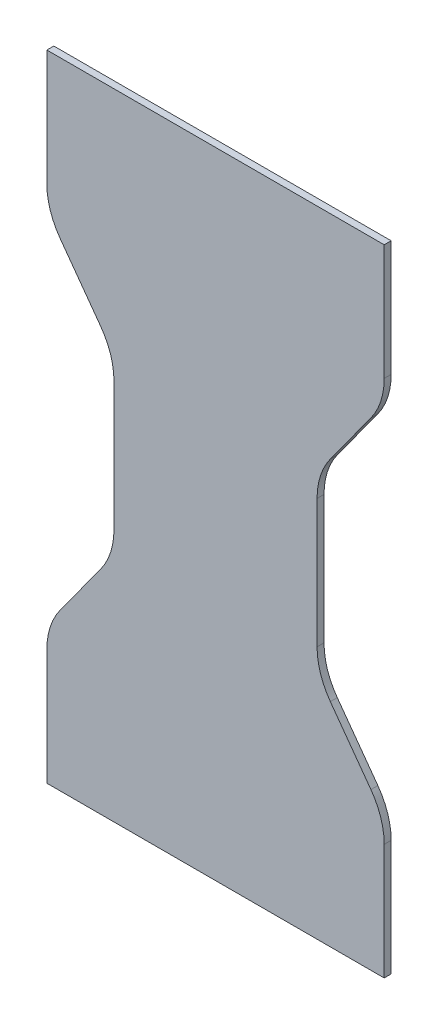
ISO-10303-21;
HEADER;
FILE_DESCRIPTION(('STEP AP214'),'2;1');
FILE_NAME('part.step','',(''),(''),'','','');
FILE_SCHEMA(('AUTOMOTIVE_DESIGN { 1 0 10303 214 1 1 1 1 }'));
ENDSEC;
DATA;
#1=APPLICATION_CONTEXT('core data for automotive mechanical design processes');
#2=APPLICATION_PROTOCOL_DEFINITION('international standard','automotive_design',2000,#1);
#3=PRODUCT_CONTEXT('',#1,'mechanical');
#4=PRODUCT('Part','Part','',(#3));
#5=PRODUCT_RELATED_PRODUCT_CATEGORY('part','',(#4));
#6=PRODUCT_DEFINITION_FORMATION('','',#4);
#7=PRODUCT_DEFINITION_CONTEXT('part definition',#1,'design');
#8=PRODUCT_DEFINITION('design','',#6,#7);
#9=PRODUCT_DEFINITION_SHAPE('','',#8);
#10=(LENGTH_UNIT() NAMED_UNIT(*) SI_UNIT(.MILLI.,.METRE.));
#11=(NAMED_UNIT(*) PLANE_ANGLE_UNIT() SI_UNIT($,.RADIAN.));
#12=(NAMED_UNIT(*) SI_UNIT($,.STERADIAN.) SOLID_ANGLE_UNIT());
#13=UNCERTAINTY_MEASURE_WITH_UNIT(LENGTH_MEASURE(1.E-05),#10,'distance_accuracy_value','');
#14=(GEOMETRIC_REPRESENTATION_CONTEXT(3) GLOBAL_UNCERTAINTY_ASSIGNED_CONTEXT((#13)) GLOBAL_UNIT_ASSIGNED_CONTEXT((#10,
#11,#12)) REPRESENTATION_CONTEXT('',''));
#15=CARTESIAN_POINT('',(0.,0.,0.));
#16=DIRECTION('',(0.,0.,1.));
#17=DIRECTION('',(1.,0.,0.));
#18=AXIS2_PLACEMENT_3D('',#15,#16,#17);
#19=CARTESIAN_POINT('',(-72.8627802887353,77.4150756936639,3.));
#20=DIRECTION('',(1.,0.,0.));
#21=DIRECTION('',(0.,1.,0.));
#22=AXIS2_PLACEMENT_3D('',#19,#20,#21);
#23=PLANE('',#22);
#24=DIRECTION('',(0.,-1.,0.));
#25=VECTOR('',#24,1.);
#26=CARTESIAN_POINT('',(-72.8627802887353,77.4150756936639,0.));
#27=LINE('',#26,#25);
#28=CARTESIAN_POINT('',(-72.8627802887354,137.153468778796,0.));
#29=VERTEX_POINT('',#28);
#30=CARTESIAN_POINT('',(-72.8627802887353,87.162666580651,0.));
#31=VERTEX_POINT('',#30);
#32=EDGE_CURVE('E213',#29,#31,#27,.T.);
#33=ORIENTED_EDGE('',*,*,#32,.T.);
#34=DIRECTION('',(0.,0.,-1.));
#35=VECTOR('',#34,1.);
#36=CARTESIAN_POINT('',(-72.8627802887353,87.162666580651,3.));
#37=LINE('',#36,#35);
#38=CARTESIAN_POINT('',(-72.8627802887353,87.162666580651,3.));
#39=VERTEX_POINT('',#38);
#40=EDGE_CURVE('E300',#31,#39,#37,.F.);
#41=ORIENTED_EDGE('',*,*,#40,.T.);
#42=DIRECTION('',(0.,-1.,0.));
#43=VECTOR('',#42,1.);
#44=CARTESIAN_POINT('',(-72.8627802887353,77.4150756936639,3.));
#45=LINE('',#44,#43);
#46=CARTESIAN_POINT('',(-72.8627802887354,137.153468778796,3.));
#47=VERTEX_POINT('',#46);
#48=EDGE_CURVE('E243',#47,#39,#45,.T.);
#49=ORIENTED_EDGE('',*,*,#48,.F.);
#50=DIRECTION('',(0.,0.,-1.));
#51=VECTOR('',#50,1.);
#52=CARTESIAN_POINT('',(-72.8627802887354,137.153468778796,3.));
#53=LINE('',#52,#51);
#54=EDGE_CURVE('E212',#47,#29,#53,.T.);
#55=ORIENTED_EDGE('',*,*,#54,.T.);
#56=EDGE_LOOP('',(#33,#41,#49,#55));
#57=FACE_BOUND('',#56,.T.);
#58=ADVANCED_FACE('F32',(#57),#23,.F.);
#59=CARTESIAN_POINT('',(-43.8627802887353,37.5,3.));
#60=DIRECTION('',(0.809016994374946,0.587785252292475,0.));
#61=DIRECTION('',(-0.587785252292475,0.809016994374946,0.));
#62=AXIS2_PLACEMENT_3D('',#59,#60,#61);
#63=PLANE('',#62);
#64=DIRECTION('',(0.587785252292475,-0.809016994374946,0.));
#65=VECTOR('',#64,1.);
#66=CARTESIAN_POINT('',(-43.8627802887353,37.5,0.));
#67=LINE('',#66,#65);
#68=CARTESIAN_POINT('',(-67.1332901199837,69.5291090118769,0.));
#69=VERTEX_POINT('',#68);
#70=CARTESIAN_POINT('',(-49.5922704574869,45.385966681787,0.));
#71=VERTEX_POINT('',#70);
#72=EDGE_CURVE('E216',#69,#71,#67,.T.);
#73=ORIENTED_EDGE('',*,*,#72,.T.);
#74=DIRECTION('',(0.,0.,-1.));
#75=VECTOR('',#74,1.);
#76=CARTESIAN_POINT('',(-49.5922704574869,45.385966681787,3.));
#77=LINE('',#76,#75);
#78=CARTESIAN_POINT('',(-49.5922704574869,45.385966681787,3.));
#79=VERTEX_POINT('',#78);
#80=EDGE_CURVE('E298',#71,#79,#77,.F.);
#81=ORIENTED_EDGE('',*,*,#80,.T.);
#82=DIRECTION('',(0.587785252292475,-0.809016994374946,0.));
#83=VECTOR('',#82,1.);
#84=CARTESIAN_POINT('',(-43.8627802887353,37.5,3.));
#85=LINE('',#84,#83);
#86=CARTESIAN_POINT('',(-67.1332901199837,69.5291090118769,3.));
#87=VERTEX_POINT('',#86);
#88=EDGE_CURVE('E331',#87,#79,#85,.T.);
#89=ORIENTED_EDGE('',*,*,#88,.F.);
#90=DIRECTION('',(0.,0.,-1.));
#91=VECTOR('',#90,1.);
#92=CARTESIAN_POINT('',(-67.1332901199836,69.5291090118769,3.));
#93=LINE('',#92,#91);
#94=EDGE_CURVE('E295',#87,#69,#93,.T.);
#95=ORIENTED_EDGE('',*,*,#94,.T.);
#96=EDGE_LOOP('',(#73,#81,#89,#95));
#97=FACE_BOUND('',#96,.T.);
#98=ADVANCED_FACE('F321',(#97),#63,.F.);
#99=CARTESIAN_POINT('',(-43.8627802887353,-37.5,3.));
#100=DIRECTION('',(1.,0.,0.));
#101=DIRECTION('',(0.,0.,-1.));
#102=AXIS2_PLACEMENT_3D('',#99,#100,#101);
#103=PLANE('',#102);
#104=DIRECTION('',(0.,-1.,0.));
#105=VECTOR('',#104,1.);
#106=CARTESIAN_POINT('',(-43.8627802887353,-37.5,0.));
#107=LINE('',#106,#105);
#108=CARTESIAN_POINT('',(-43.8627802887353,27.7524091130128,0.));
#109=VERTEX_POINT('',#108);
#110=CARTESIAN_POINT('',(-43.8627802887353,-27.7524091130129,0.));
#111=VERTEX_POINT('',#110);
#112=EDGE_CURVE('E219',#109,#111,#107,.T.);
#113=ORIENTED_EDGE('',*,*,#112,.T.);
#114=DIRECTION('',(0.,0.,-1.));
#115=VECTOR('',#114,1.);
#116=CARTESIAN_POINT('',(-43.8627802887353,-27.7524091130129,3.));
#117=LINE('',#116,#115);
#118=CARTESIAN_POINT('',(-43.8627802887353,-27.7524091130129,3.));
#119=VERTEX_POINT('',#118);
#120=EDGE_CURVE('E291',#111,#119,#117,.F.);
#121=ORIENTED_EDGE('',*,*,#120,.T.);
#122=DIRECTION('',(0.,-1.,0.));
#123=VECTOR('',#122,1.);
#124=CARTESIAN_POINT('',(-43.8627802887353,-37.5,3.));
#125=LINE('',#124,#123);
#126=CARTESIAN_POINT('',(-43.8627802887353,27.7524091130128,3.));
#127=VERTEX_POINT('',#126);
#128=EDGE_CURVE('E329',#127,#119,#125,.T.);
#129=ORIENTED_EDGE('',*,*,#128,.F.);
#130=DIRECTION('',(0.,0.,-1.));
#131=VECTOR('',#130,1.);
#132=CARTESIAN_POINT('',(-43.8627802887353,27.7524091130128,0.));
#133=LINE('',#132,#131);
#134=EDGE_CURVE('E288',#127,#109,#133,.T.);
#135=ORIENTED_EDGE('',*,*,#134,.T.);
#136=EDGE_LOOP('',(#113,#121,#129,#135));
#137=FACE_BOUND('',#136,.T.);
#138=ADVANCED_FACE('F333',(#137),#103,.F.);
#139=CARTESIAN_POINT('',(-43.8627802887353,-37.5,3.));
#140=DIRECTION('',(0.809016994374951,-0.587785252292468,0.));
#141=DIRECTION('',(0.587785252292468,0.809016994374951,0.));
#142=AXIS2_PLACEMENT_3D('',#139,#140,#141);
#143=PLANE('',#142);
#144=DIRECTION('',(-0.587785252292468,-0.809016994374951,0.));
#145=VECTOR('',#144,1.);
#146=CARTESIAN_POINT('',(-43.8627802887353,-37.5,3.));
#147=LINE('',#146,#145);
#148=CARTESIAN_POINT('',(-49.5922704574867,-45.385966681787,3.));
#149=VERTEX_POINT('',#148);
#150=CARTESIAN_POINT('',(-67.1332901199838,-69.5291090118776,3.));
#151=VERTEX_POINT('',#150);
#152=EDGE_CURVE('E182',#149,#151,#147,.T.);
#153=ORIENTED_EDGE('',*,*,#152,.F.);
#154=DIRECTION('',(0.,0.,-1.));
#155=VECTOR('',#154,1.);
#156=CARTESIAN_POINT('',(-49.5922704574867,-45.385966681787,0.));
#157=LINE('',#156,#155);
#158=CARTESIAN_POINT('',(-49.5922704574867,-45.385966681787,0.));
#159=VERTEX_POINT('',#158);
#160=EDGE_CURVE('E285',#149,#159,#157,.T.);
#161=ORIENTED_EDGE('',*,*,#160,.T.);
#162=DIRECTION('',(-0.587785252292468,-0.809016994374951,0.));
#163=VECTOR('',#162,1.);
#164=CARTESIAN_POINT('',(-43.8627802887353,-37.5,0.));
#165=LINE('',#164,#163);
#166=CARTESIAN_POINT('',(-67.1332901199838,-69.5291090118776,0.));
#167=VERTEX_POINT('',#166);
#168=EDGE_CURVE('E222',#159,#167,#165,.T.);
#169=ORIENTED_EDGE('',*,*,#168,.T.);
#170=DIRECTION('',(0.,0.,-1.));
#171=VECTOR('',#170,1.);
#172=CARTESIAN_POINT('',(-67.1332901199838,-69.5291090118776,3.));
#173=LINE('',#172,#171);
#174=EDGE_CURVE('E283',#167,#151,#173,.F.);
#175=ORIENTED_EDGE('',*,*,#174,.T.);
#176=EDGE_LOOP('',(#153,#161,#169,#175));
#177=FACE_BOUND('',#176,.T.);
#178=ADVANCED_FACE('F524',(#177),#143,.F.);
#179=CARTESIAN_POINT('',(-72.8627802887354,-137.153468778796,3.));
#180=DIRECTION('',(1.,0.,0.));
#181=DIRECTION('',(0.,1.,0.));
#182=AXIS2_PLACEMENT_3D('',#179,#180,#181);
#183=PLANE('',#182);
#184=DIRECTION('',(0.,-1.,0.));
#185=VECTOR('',#184,1.);
#186=CARTESIAN_POINT('',(-72.8627802887354,-137.153468778796,3.));
#187=LINE('',#186,#185);
#188=CARTESIAN_POINT('',(-72.8627802887353,-87.1626665806516,3.));
#189=VERTEX_POINT('',#188);
#190=CARTESIAN_POINT('',(-72.8627802887354,-137.153468778796,3.));
#191=VERTEX_POINT('',#190);
#192=EDGE_CURVE('E168',#189,#191,#187,.T.);
#193=ORIENTED_EDGE('',*,*,#192,.F.);
#194=DIRECTION('',(0.,0.,-1.));
#195=VECTOR('',#194,1.);
#196=CARTESIAN_POINT('',(-72.8627802887353,-87.1626665806516,3.));
#197=LINE('',#196,#195);
#198=CARTESIAN_POINT('',(-72.8627802887353,-87.1626665806516,0.));
#199=VERTEX_POINT('',#198);
#200=EDGE_CURVE('E293',#189,#199,#197,.T.);
#201=ORIENTED_EDGE('',*,*,#200,.T.);
#202=DIRECTION('',(0.,-1.,0.));
#203=VECTOR('',#202,1.);
#204=CARTESIAN_POINT('',(-72.8627802887354,-137.153468778796,0.));
#205=LINE('',#204,#203);
#206=CARTESIAN_POINT('',(-72.8627802887354,-137.153468778796,0.));
#207=VERTEX_POINT('',#206);
#208=EDGE_CURVE('E188',#199,#207,#205,.T.);
#209=ORIENTED_EDGE('',*,*,#208,.T.);
#210=DIRECTION('',(0.,0.,-1.));
#211=VECTOR('',#210,1.);
#212=CARTESIAN_POINT('',(-72.8627802887354,-137.153468778796,3.));
#213=LINE('',#212,#211);
#214=EDGE_CURVE('E185',#191,#207,#213,.T.);
#215=ORIENTED_EDGE('',*,*,#214,.F.);
#216=EDGE_LOOP('',(#193,#201,#209,#215));
#217=FACE_BOUND('',#216,.T.);
#218=ADVANCED_FACE('F186',(#217),#183,.F.);
#219=CARTESIAN_POINT('',(72.8627802887354,-137.153468778796,3.));
#220=DIRECTION('',(0.,1.,0.));
#221=DIRECTION('',(0.,0.,1.));
#222=AXIS2_PLACEMENT_3D('',#219,#220,#221);
#223=PLANE('',#222);
#224=DIRECTION('',(1.,0.,0.));
#225=VECTOR('',#224,1.);
#226=CARTESIAN_POINT('',(72.8627802887354,-137.153468778796,0.));
#227=LINE('',#226,#225);
#228=CARTESIAN_POINT('',(72.8627802887354,-137.153468778796,0.));
#229=VERTEX_POINT('',#228);
#230=EDGE_CURVE('E226',#207,#229,#227,.T.);
#231=ORIENTED_EDGE('',*,*,#230,.T.);
#232=DIRECTION('',(0.,0.,-1.));
#233=VECTOR('',#232,1.);
#234=CARTESIAN_POINT('',(72.8627802887354,-137.153468778796,3.));
#235=LINE('',#234,#233);
#236=CARTESIAN_POINT('',(72.8627802887354,-137.153468778796,3.));
#237=VERTEX_POINT('',#236);
#238=EDGE_CURVE('E192',#237,#229,#235,.T.);
#239=ORIENTED_EDGE('',*,*,#238,.F.);
#240=DIRECTION('',(1.,0.,0.));
#241=VECTOR('',#240,1.);
#242=CARTESIAN_POINT('',(72.8627802887354,-137.153468778796,3.));
#243=LINE('',#242,#241);
#244=EDGE_CURVE('E174',#191,#237,#243,.T.);
#245=ORIENTED_EDGE('',*,*,#244,.F.);
#246=ORIENTED_EDGE('',*,*,#214,.T.);
#247=EDGE_LOOP('',(#231,#239,#245,#246));
#248=FACE_BOUND('',#247,.T.);
#249=ADVANCED_FACE('F194',(#248),#223,.F.);
#250=CARTESIAN_POINT('',(72.8627802887354,-137.153468778796,3.));
#251=DIRECTION('',(-1.,0.,0.));
#252=DIRECTION('',(0.,-1.,0.));
#253=AXIS2_PLACEMENT_3D('',#250,#251,#252);
#254=PLANE('',#253);
#255=DIRECTION('',(0.,1.,0.));
#256=VECTOR('',#255,1.);
#257=CARTESIAN_POINT('',(72.8627802887354,-137.153468778796,0.));
#258=LINE('',#257,#256);
#259=CARTESIAN_POINT('',(72.8627802887353,-87.1626665806516,0.));
#260=VERTEX_POINT('',#259);
#261=EDGE_CURVE('E228',#229,#260,#258,.T.);
#262=ORIENTED_EDGE('',*,*,#261,.T.);
#263=DIRECTION('',(0.,0.,-1.));
#264=VECTOR('',#263,1.);
#265=CARTESIAN_POINT('',(72.8627802887353,-87.1626665806516,3.));
#266=LINE('',#265,#264);
#267=CARTESIAN_POINT('',(72.8627802887353,-87.1626665806516,3.));
#268=VERTEX_POINT('',#267);
#269=EDGE_CURVE('E281',#260,#268,#266,.F.);
#270=ORIENTED_EDGE('',*,*,#269,.T.);
#271=DIRECTION('',(0.,1.,0.));
#272=VECTOR('',#271,1.);
#273=CARTESIAN_POINT('',(72.8627802887354,-137.153468778796,3.));
#274=LINE('',#273,#272);
#275=EDGE_CURVE('E197',#237,#268,#274,.T.);
#276=ORIENTED_EDGE('',*,*,#275,.F.);
#277=ORIENTED_EDGE('',*,*,#238,.T.);
#278=EDGE_LOOP('',(#262,#270,#276,#277));
#279=FACE_BOUND('',#278,.T.);
#280=ADVANCED_FACE('F384',(#279),#254,.F.);
#281=CARTESIAN_POINT('',(43.8627802887353,-37.5,3.));
#282=DIRECTION('',(-0.809016994374951,-0.587785252292468,0.));
#283=DIRECTION('',(0.587785252292468,-0.809016994374951,0.));
#284=AXIS2_PLACEMENT_3D('',#281,#282,#283);
#285=PLANE('',#284);
#286=DIRECTION('',(-0.587785252292468,0.809016994374951,0.));
#287=VECTOR('',#286,1.);
#288=CARTESIAN_POINT('',(43.8627802887353,-37.5,0.));
#289=LINE('',#288,#287);
#290=CARTESIAN_POINT('',(67.1332901199838,-69.5291090118776,0.));
#291=VERTEX_POINT('',#290);
#292=CARTESIAN_POINT('',(49.5922704574867,-45.385966681787,0.));
#293=VERTEX_POINT('',#292);
#294=EDGE_CURVE('E231',#291,#293,#289,.T.);
#295=ORIENTED_EDGE('',*,*,#294,.T.);
#296=DIRECTION('',(0.,0.,-1.));
#297=VECTOR('',#296,1.);
#298=CARTESIAN_POINT('',(49.5922704574867,-45.385966681787,3.));
#299=LINE('',#298,#297);
#300=CARTESIAN_POINT('',(49.5922704574867,-45.385966681787,3.));
#301=VERTEX_POINT('',#300);
#302=EDGE_CURVE('E279',#293,#301,#299,.F.);
#303=ORIENTED_EDGE('',*,*,#302,.T.);
#304=DIRECTION('',(-0.587785252292468,0.809016994374951,0.));
#305=VECTOR('',#304,1.);
#306=CARTESIAN_POINT('',(43.8627802887353,-37.5,3.));
#307=LINE('',#306,#305);
#308=CARTESIAN_POINT('',(67.1332901199838,-69.5291090118776,3.));
#309=VERTEX_POINT('',#308);
#310=EDGE_CURVE('E199',#309,#301,#307,.T.);
#311=ORIENTED_EDGE('',*,*,#310,.F.);
#312=DIRECTION('',(0.,0.,-1.));
#313=VECTOR('',#312,1.);
#314=CARTESIAN_POINT('',(67.1332901199838,-69.5291090118776,3.));
#315=LINE('',#314,#313);
#316=EDGE_CURVE('E276',#309,#291,#315,.T.);
#317=ORIENTED_EDGE('',*,*,#316,.T.);
#318=EDGE_LOOP('',(#295,#303,#311,#317));
#319=FACE_BOUND('',#318,.T.);
#320=ADVANCED_FACE('F375',(#319),#285,.F.);
#321=CARTESIAN_POINT('',(43.8627802887353,-37.5,3.));
#322=DIRECTION('',(-1.,0.,0.));
#323=DIRECTION('',(0.,0.,1.));
#324=AXIS2_PLACEMENT_3D('',#321,#322,#323);
#325=PLANE('',#324);
#326=DIRECTION('',(0.,1.,0.));
#327=VECTOR('',#326,1.);
#328=CARTESIAN_POINT('',(43.8627802887353,-37.5,0.));
#329=LINE('',#328,#327);
#330=CARTESIAN_POINT('',(43.8627802887353,-27.7524091130129,0.));
#331=VERTEX_POINT('',#330);
#332=CARTESIAN_POINT('',(43.8627802887353,27.7524091130128,0.));
#333=VERTEX_POINT('',#332);
#334=EDGE_CURVE('E234',#331,#333,#329,.T.);
#335=ORIENTED_EDGE('',*,*,#334,.T.);
#336=DIRECTION('',(0.,0.,-1.));
#337=VECTOR('',#336,1.);
#338=CARTESIAN_POINT('',(43.8627802887353,27.7524091130128,3.));
#339=LINE('',#338,#337);
#340=CARTESIAN_POINT('',(43.8627802887353,27.7524091130128,3.));
#341=VERTEX_POINT('',#340);
#342=EDGE_CURVE('E47',#333,#341,#339,.F.);
#343=ORIENTED_EDGE('',*,*,#342,.T.);
#344=DIRECTION('',(0.,1.,0.));
#345=VECTOR('',#344,1.);
#346=CARTESIAN_POINT('',(43.8627802887353,-37.5,3.));
#347=LINE('',#346,#345);
#348=CARTESIAN_POINT('',(43.8627802887353,-27.7524091130129,3.));
#349=VERTEX_POINT('',#348);
#350=EDGE_CURVE('E204',#349,#341,#347,.T.);
#351=ORIENTED_EDGE('',*,*,#350,.F.);
#352=DIRECTION('',(0.,0.,-1.));
#353=VECTOR('',#352,1.);
#354=CARTESIAN_POINT('',(43.8627802887353,-27.7524091130129,0.));
#355=LINE('',#354,#353);
#356=EDGE_CURVE('E272',#349,#331,#355,.T.);
#357=ORIENTED_EDGE('',*,*,#356,.T.);
#358=EDGE_LOOP('',(#335,#343,#351,#357));
#359=FACE_BOUND('',#358,.T.);
#360=ADVANCED_FACE('F368',(#359),#325,.F.);
#361=CARTESIAN_POINT('',(43.8627802887353,37.5,3.));
#362=DIRECTION('',(-0.809016994374946,0.587785252292475,0.));
#363=DIRECTION('',(-0.587785252292475,-0.809016994374946,0.));
#364=AXIS2_PLACEMENT_3D('',#361,#362,#363);
#365=PLANE('',#364);
#366=DIRECTION('',(0.587785252292475,0.809016994374946,0.));
#367=VECTOR('',#366,1.);
#368=CARTESIAN_POINT('',(43.8627802887353,37.5,0.));
#369=LINE('',#368,#367);
#370=CARTESIAN_POINT('',(49.5922704574869,45.385966681787,0.));
#371=VERTEX_POINT('',#370);
#372=CARTESIAN_POINT('',(67.1332901199837,69.5291090118769,0.));
#373=VERTEX_POINT('',#372);
#374=EDGE_CURVE('E236',#371,#373,#369,.T.);
#375=ORIENTED_EDGE('',*,*,#374,.T.);
#376=DIRECTION('',(0.,0.,-1.));
#377=VECTOR('',#376,1.);
#378=CARTESIAN_POINT('',(67.1332901199836,69.5291090118769,3.));
#379=LINE('',#378,#377);
#380=CARTESIAN_POINT('',(67.1332901199837,69.5291090118769,3.));
#381=VERTEX_POINT('',#380);
#382=EDGE_CURVE('E263',#373,#381,#379,.F.);
#383=ORIENTED_EDGE('',*,*,#382,.T.);
#384=DIRECTION('',(0.587785252292475,0.809016994374946,0.));
#385=VECTOR('',#384,1.);
#386=CARTESIAN_POINT('',(43.8627802887353,37.5,3.));
#387=LINE('',#386,#385);
#388=CARTESIAN_POINT('',(49.5922704574869,45.385966681787,3.));
#389=VERTEX_POINT('',#388);
#390=EDGE_CURVE('E206',#389,#381,#387,.T.);
#391=ORIENTED_EDGE('',*,*,#390,.F.);
#392=DIRECTION('',(0.,0.,-1.));
#393=VECTOR('',#392,1.);
#394=CARTESIAN_POINT('',(49.5922704574869,45.385966681787,0.));
#395=LINE('',#394,#393);
#396=EDGE_CURVE('E260',#389,#371,#395,.T.);
#397=ORIENTED_EDGE('',*,*,#396,.T.);
#398=EDGE_LOOP('',(#375,#383,#391,#397));
#399=FACE_BOUND('',#398,.T.);
#400=ADVANCED_FACE('F362',(#399),#365,.F.);
#401=CARTESIAN_POINT('',(72.8627802887353,77.4150756936639,3.));
#402=DIRECTION('',(-1.,0.,0.));
#403=DIRECTION('',(0.,-1.,0.));
#404=AXIS2_PLACEMENT_3D('',#401,#402,#403);
#405=PLANE('',#404);
#406=DIRECTION('',(0.,1.,0.));
#407=VECTOR('',#406,1.);
#408=CARTESIAN_POINT('',(72.8627802887353,77.4150756936639,3.));
#409=LINE('',#408,#407);
#410=CARTESIAN_POINT('',(72.8627802887353,87.162666580651,3.));
#411=VERTEX_POINT('',#410);
#412=CARTESIAN_POINT('',(72.8627802887354,137.153468778796,3.));
#413=VERTEX_POINT('',#412);
#414=EDGE_CURVE('E208',#411,#413,#409,.T.);
#415=ORIENTED_EDGE('',*,*,#414,.F.);
#416=DIRECTION('',(0.,0.,-1.));
#417=VECTOR('',#416,1.);
#418=CARTESIAN_POINT('',(72.8627802887353,87.162666580651,3.));
#419=LINE('',#418,#417);
#420=CARTESIAN_POINT('',(72.8627802887353,87.162666580651,0.));
#421=VERTEX_POINT('',#420);
#422=EDGE_CURVE('E191',#411,#421,#419,.T.);
#423=ORIENTED_EDGE('',*,*,#422,.T.);
#424=DIRECTION('',(0.,1.,0.));
#425=VECTOR('',#424,1.);
#426=CARTESIAN_POINT('',(72.8627802887353,77.4150756936639,0.));
#427=LINE('',#426,#425);
#428=CARTESIAN_POINT('',(72.8627802887354,137.153468778796,0.));
#429=VERTEX_POINT('',#428);
#430=EDGE_CURVE('E239',#421,#429,#427,.T.);
#431=ORIENTED_EDGE('',*,*,#430,.T.);
#432=DIRECTION('',(0.,0.,-1.));
#433=VECTOR('',#432,1.);
#434=CARTESIAN_POINT('',(72.8627802887354,137.153468778796,3.));
#435=LINE('',#434,#433);
#436=EDGE_CURVE('E246',#413,#429,#435,.T.);
#437=ORIENTED_EDGE('',*,*,#436,.F.);
#438=EDGE_LOOP('',(#415,#423,#431,#437));
#439=FACE_BOUND('',#438,.T.);
#440=ADVANCED_FACE('F354',(#439),#405,.F.);
#441=CARTESIAN_POINT('',(72.8627802887354,137.153468778796,3.));
#442=DIRECTION('',(0.,-1.,0.));
#443=DIRECTION('',(0.,0.,-1.));
#444=AXIS2_PLACEMENT_3D('',#441,#442,#443);
#445=PLANE('',#444);
#446=DIRECTION('',(-1.,0.,0.));
#447=VECTOR('',#446,1.);
#448=CARTESIAN_POINT('',(72.8627802887354,137.153468778796,0.));
#449=LINE('',#448,#447);
#450=EDGE_CURVE('E241',#429,#29,#449,.T.);
#451=ORIENTED_EDGE('',*,*,#450,.T.);
#452=ORIENTED_EDGE('',*,*,#54,.F.);
#453=DIRECTION('',(-1.,0.,0.));
#454=VECTOR('',#453,1.);
#455=CARTESIAN_POINT('',(72.8627802887354,137.153468778796,3.));
#456=LINE('',#455,#454);
#457=EDGE_CURVE('E210',#413,#47,#456,.T.);
#458=ORIENTED_EDGE('',*,*,#457,.F.);
#459=ORIENTED_EDGE('',*,*,#436,.T.);
#460=EDGE_LOOP('',(#451,#452,#458,#459));
#461=FACE_BOUND('',#460,.T.);
#462=ADVANCED_FACE('F349',(#461),#445,.F.);
#463=CARTESIAN_POINT('',(0.,0.,3.));
#464=DIRECTION('',(0.,0.,1.));
#465=DIRECTION('',(1.,0.,0.));
#466=AXIS2_PLACEMENT_3D('',#463,#464,#465);
#467=PLANE('',#466);
#468=ORIENTED_EDGE('',*,*,#390,.T.);
#469=CARTESIAN_POINT('',(42.8627802887353,87.1626665806511,3.));
#470=DIRECTION('',(0.,0.,1.));
#471=DIRECTION('',(1.,0.,0.));
#472=AXIS2_PLACEMENT_3D('',#469,#470,#471);
#473=CIRCLE('',#472,30.);
#474=EDGE_CURVE('E270',#381,#411,#473,.T.);
#475=ORIENTED_EDGE('',*,*,#474,.T.);
#476=ORIENTED_EDGE('',*,*,#414,.T.);
#477=ORIENTED_EDGE('',*,*,#457,.T.);
#478=ORIENTED_EDGE('',*,*,#48,.T.);
#479=CARTESIAN_POINT('',(-42.8627802887353,87.1626665806511,3.));
#480=DIRECTION('',(0.,0.,1.));
#481=DIRECTION('',(1.,0.,0.));
#482=AXIS2_PLACEMENT_3D('',#479,#480,#481);
#483=CIRCLE('',#482,30.);
#484=EDGE_CURVE('E265',#39,#87,#483,.T.);
#485=ORIENTED_EDGE('',*,*,#484,.T.);
#486=ORIENTED_EDGE('',*,*,#88,.T.);
#487=CARTESIAN_POINT('',(-73.8627802887353,27.7524091130128,3.));
#488=DIRECTION('',(0.,0.,1.));
#489=DIRECTION('',(1.,0.,0.));
#490=AXIS2_PLACEMENT_3D('',#487,#488,#489);
#491=CIRCLE('',#490,30.);
#492=EDGE_CURVE('E11',#79,#127,#491,.F.);
#493=ORIENTED_EDGE('',*,*,#492,.T.);
#494=ORIENTED_EDGE('',*,*,#128,.T.);
#495=CARTESIAN_POINT('',(-73.8627802887353,-27.7524091130129,3.));
#496=DIRECTION('',(0.,0.,1.));
#497=DIRECTION('',(1.,0.,0.));
#498=AXIS2_PLACEMENT_3D('',#495,#496,#497);
#499=CIRCLE('',#498,30.);
#500=EDGE_CURVE('E311',#119,#149,#499,.F.);
#501=ORIENTED_EDGE('',*,*,#500,.T.);
#502=ORIENTED_EDGE('',*,*,#152,.T.);
#503=CARTESIAN_POINT('',(-42.8627802887353,-87.1626665806516,3.));
#504=DIRECTION('',(0.,0.,1.));
#505=DIRECTION('',(1.,0.,0.));
#506=AXIS2_PLACEMENT_3D('',#503,#504,#505);
#507=CIRCLE('',#506,30.);
#508=EDGE_CURVE('E178',#151,#189,#507,.T.);
#509=ORIENTED_EDGE('',*,*,#508,.T.);
#510=ORIENTED_EDGE('',*,*,#192,.T.);
#511=ORIENTED_EDGE('',*,*,#244,.T.);
#512=ORIENTED_EDGE('',*,*,#275,.T.);
#513=CARTESIAN_POINT('',(42.8627802887353,-87.1626665806516,3.));
#514=DIRECTION('',(0.,0.,1.));
#515=DIRECTION('',(1.,0.,0.));
#516=AXIS2_PLACEMENT_3D('',#513,#514,#515);
#517=CIRCLE('',#516,30.);
#518=EDGE_CURVE('E268',#268,#309,#517,.T.);
#519=ORIENTED_EDGE('',*,*,#518,.T.);
#520=ORIENTED_EDGE('',*,*,#310,.T.);
#521=CARTESIAN_POINT('',(73.8627802887353,-27.7524091130129,3.));
#522=DIRECTION('',(0.,0.,1.));
#523=DIRECTION('',(1.,0.,0.));
#524=AXIS2_PLACEMENT_3D('',#521,#522,#523);
#525=CIRCLE('',#524,30.);
#526=EDGE_CURVE('E54',#301,#349,#525,.F.);
#527=ORIENTED_EDGE('',*,*,#526,.T.);
#528=ORIENTED_EDGE('',*,*,#350,.T.);
#529=CARTESIAN_POINT('',(73.8627802887353,27.7524091130128,3.));
#530=DIRECTION('',(0.,0.,1.));
#531=DIRECTION('',(1.,0.,0.));
#532=AXIS2_PLACEMENT_3D('',#529,#530,#531);
#533=CIRCLE('',#532,30.);
#534=EDGE_CURVE('E304',#341,#389,#533,.F.);
#535=ORIENTED_EDGE('',*,*,#534,.T.);
#536=EDGE_LOOP('',(#468,#475,#476,#477,#478,#485,#486,#493,#494,#501,#502,#509,#510,#511,#512,
#519,#520,#527,#528,#535));
#537=FACE_BOUND('',#536,.T.);
#538=ADVANCED_FACE('F171',(#537),#467,.T.);
#539=CARTESIAN_POINT('',(0.,0.,0.));
#540=DIRECTION('',(0.,0.,1.));
#541=DIRECTION('',(1.,0.,0.));
#542=AXIS2_PLACEMENT_3D('',#539,#540,#541);
#543=PLANE('',#542);
#544=ORIENTED_EDGE('',*,*,#430,.F.);
#545=CARTESIAN_POINT('',(42.8627802887353,87.1626665806511,0.));
#546=DIRECTION('',(0.,0.,1.));
#547=DIRECTION('',(1.,0.,0.));
#548=AXIS2_PLACEMENT_3D('',#545,#546,#547);
#549=CIRCLE('',#548,30.);
#550=EDGE_CURVE('E258',#421,#373,#549,.F.);
#551=ORIENTED_EDGE('',*,*,#550,.T.);
#552=ORIENTED_EDGE('',*,*,#374,.F.);
#553=CARTESIAN_POINT('',(73.8627802887353,27.7524091130128,0.));
#554=DIRECTION('',(0.,0.,1.));
#555=DIRECTION('',(1.,0.,0.));
#556=AXIS2_PLACEMENT_3D('',#553,#554,#555);
#557=CIRCLE('',#556,30.);
#558=EDGE_CURVE('E302',#371,#333,#557,.T.);
#559=ORIENTED_EDGE('',*,*,#558,.T.);
#560=ORIENTED_EDGE('',*,*,#334,.F.);
#561=CARTESIAN_POINT('',(73.8627802887353,-27.7524091130129,0.));
#562=DIRECTION('',(0.,0.,1.));
#563=DIRECTION('',(1.,0.,0.));
#564=AXIS2_PLACEMENT_3D('',#561,#562,#563);
#565=CIRCLE('',#564,30.);
#566=EDGE_CURVE('E306',#331,#293,#565,.T.);
#567=ORIENTED_EDGE('',*,*,#566,.T.);
#568=ORIENTED_EDGE('',*,*,#294,.F.);
#569=CARTESIAN_POINT('',(42.8627802887353,-87.1626665806516,0.));
#570=DIRECTION('',(0.,0.,1.));
#571=DIRECTION('',(1.,0.,0.));
#572=AXIS2_PLACEMENT_3D('',#569,#570,#571);
#573=CIRCLE('',#572,30.);
#574=EDGE_CURVE('E256',#291,#260,#573,.F.);
#575=ORIENTED_EDGE('',*,*,#574,.T.);
#576=ORIENTED_EDGE('',*,*,#261,.F.);
#577=ORIENTED_EDGE('',*,*,#230,.F.);
#578=ORIENTED_EDGE('',*,*,#208,.F.);
#579=CARTESIAN_POINT('',(-42.8627802887353,-87.1626665806516,0.));
#580=DIRECTION('',(0.,0.,1.));
#581=DIRECTION('',(1.,0.,0.));
#582=AXIS2_PLACEMENT_3D('',#579,#580,#581);
#583=CIRCLE('',#582,30.);
#584=EDGE_CURVE('E254',#199,#167,#583,.F.);
#585=ORIENTED_EDGE('',*,*,#584,.T.);
#586=ORIENTED_EDGE('',*,*,#168,.F.);
#587=CARTESIAN_POINT('',(-73.8627802887353,-27.7524091130129,0.));
#588=DIRECTION('',(0.,0.,1.));
#589=DIRECTION('',(1.,0.,0.));
#590=AXIS2_PLACEMENT_3D('',#587,#588,#589);
#591=CIRCLE('',#590,30.);
#592=EDGE_CURVE('E309',#159,#111,#591,.T.);
#593=ORIENTED_EDGE('',*,*,#592,.T.);
#594=ORIENTED_EDGE('',*,*,#112,.F.);
#595=CARTESIAN_POINT('',(-73.8627802887353,27.7524091130128,0.));
#596=DIRECTION('',(0.,0.,1.));
#597=DIRECTION('',(1.,0.,0.));
#598=AXIS2_PLACEMENT_3D('',#595,#596,#597);
#599=CIRCLE('',#598,30.);
#600=EDGE_CURVE('E40',#109,#71,#599,.T.);
#601=ORIENTED_EDGE('',*,*,#600,.T.);
#602=ORIENTED_EDGE('',*,*,#72,.F.);
#603=CARTESIAN_POINT('',(-42.8627802887353,87.1626665806511,0.));
#604=DIRECTION('',(0.,0.,1.));
#605=DIRECTION('',(1.,0.,0.));
#606=AXIS2_PLACEMENT_3D('',#603,#604,#605);
#607=CIRCLE('',#606,30.);
#608=EDGE_CURVE('E252',#69,#31,#607,.F.);
#609=ORIENTED_EDGE('',*,*,#608,.T.);
#610=ORIENTED_EDGE('',*,*,#32,.F.);
#611=ORIENTED_EDGE('',*,*,#450,.F.);
#612=EDGE_LOOP('',(#544,#551,#552,#559,#560,#567,#568,#575,#576,#577,#578,#585,#586,#593,#594,
#601,#602,#609,#610,#611));
#613=FACE_BOUND('',#612,.T.);
#614=ADVANCED_FACE('F316',(#613),#543,.F.);
#615=CARTESIAN_POINT('',(42.8627802887353,87.1626665806511,3.));
#616=DIRECTION('',(0.,0.,-1.));
#617=DIRECTION('',(-1.,0.,0.));
#618=AXIS2_PLACEMENT_3D('',#615,#616,#617);
#619=CYLINDRICAL_SURFACE('',#618,30.);
#620=ORIENTED_EDGE('',*,*,#474,.F.);
#621=ORIENTED_EDGE('',*,*,#382,.F.);
#622=ORIENTED_EDGE('',*,*,#550,.F.);
#623=ORIENTED_EDGE('',*,*,#422,.F.);
#624=EDGE_LOOP('',(#620,#621,#622,#623));
#625=FACE_BOUND('',#624,.T.);
#626=ADVANCED_FACE('F358',(#625),#619,.T.);
#627=CARTESIAN_POINT('',(73.8627802887353,27.7524091130128,3.));
#628=DIRECTION('',(0.,0.,1.));
#629=DIRECTION('',(1.,0.,0.));
#630=AXIS2_PLACEMENT_3D('',#627,#628,#629);
#631=CYLINDRICAL_SURFACE('',#630,30.);
#632=ORIENTED_EDGE('',*,*,#534,.F.);
#633=ORIENTED_EDGE('',*,*,#342,.F.);
#634=ORIENTED_EDGE('',*,*,#558,.F.);
#635=ORIENTED_EDGE('',*,*,#396,.F.);
#636=EDGE_LOOP('',(#632,#633,#634,#635));
#637=FACE_BOUND('',#636,.T.);
#638=ADVANCED_FACE('F366',(#637),#631,.F.);
#639=CARTESIAN_POINT('',(73.8627802887353,-27.7524091130129,3.));
#640=DIRECTION('',(0.,0.,1.));
#641=DIRECTION('',(1.,0.,0.));
#642=AXIS2_PLACEMENT_3D('',#639,#640,#641);
#643=CYLINDRICAL_SURFACE('',#642,30.);
#644=ORIENTED_EDGE('',*,*,#526,.F.);
#645=ORIENTED_EDGE('',*,*,#302,.F.);
#646=ORIENTED_EDGE('',*,*,#566,.F.);
#647=ORIENTED_EDGE('',*,*,#356,.F.);
#648=EDGE_LOOP('',(#644,#645,#646,#647));
#649=FACE_BOUND('',#648,.T.);
#650=ADVANCED_FACE('F371',(#649),#643,.F.);
#651=CARTESIAN_POINT('',(42.8627802887353,-87.1626665806516,3.));
#652=DIRECTION('',(0.,0.,-1.));
#653=DIRECTION('',(-1.,0.,0.));
#654=AXIS2_PLACEMENT_3D('',#651,#652,#653);
#655=CYLINDRICAL_SURFACE('',#654,30.);
#656=ORIENTED_EDGE('',*,*,#518,.F.);
#657=ORIENTED_EDGE('',*,*,#269,.F.);
#658=ORIENTED_EDGE('',*,*,#574,.F.);
#659=ORIENTED_EDGE('',*,*,#316,.F.);
#660=EDGE_LOOP('',(#656,#657,#658,#659));
#661=FACE_BOUND('',#660,.T.);
#662=ADVANCED_FACE('F380',(#661),#655,.T.);
#663=CARTESIAN_POINT('',(-73.8627802887353,-27.7524091130129,3.));
#664=DIRECTION('',(0.,0.,1.));
#665=DIRECTION('',(1.,0.,0.));
#666=AXIS2_PLACEMENT_3D('',#663,#664,#665);
#667=CYLINDRICAL_SURFACE('',#666,30.);
#668=ORIENTED_EDGE('',*,*,#500,.F.);
#669=ORIENTED_EDGE('',*,*,#120,.F.);
#670=ORIENTED_EDGE('',*,*,#592,.F.);
#671=ORIENTED_EDGE('',*,*,#160,.F.);
#672=EDGE_LOOP('',(#668,#669,#670,#671));
#673=FACE_BOUND('',#672,.T.);
#674=ADVANCED_FACE('F409',(#673),#667,.F.);
#675=CARTESIAN_POINT('',(-42.8627802887353,-87.1626665806516,3.));
#676=DIRECTION('',(0.,0.,-1.));
#677=DIRECTION('',(-1.,0.,0.));
#678=AXIS2_PLACEMENT_3D('',#675,#676,#677);
#679=CYLINDRICAL_SURFACE('',#678,30.);
#680=ORIENTED_EDGE('',*,*,#508,.F.);
#681=ORIENTED_EDGE('',*,*,#174,.F.);
#682=ORIENTED_EDGE('',*,*,#584,.F.);
#683=ORIENTED_EDGE('',*,*,#200,.F.);
#684=EDGE_LOOP('',(#680,#681,#682,#683));
#685=FACE_BOUND('',#684,.T.);
#686=ADVANCED_FACE('F412',(#685),#679,.T.);
#687=CARTESIAN_POINT('',(-73.8627802887353,27.7524091130128,3.));
#688=DIRECTION('',(0.,0.,1.));
#689=DIRECTION('',(1.,0.,0.));
#690=AXIS2_PLACEMENT_3D('',#687,#688,#689);
#691=CYLINDRICAL_SURFACE('',#690,30.);
#692=ORIENTED_EDGE('',*,*,#492,.F.);
#693=ORIENTED_EDGE('',*,*,#80,.F.);
#694=ORIENTED_EDGE('',*,*,#600,.F.);
#695=ORIENTED_EDGE('',*,*,#134,.F.);
#696=EDGE_LOOP('',(#692,#693,#694,#695));
#697=FACE_BOUND('',#696,.T.);
#698=ADVANCED_FACE('F326',(#697),#691,.F.);
#699=CARTESIAN_POINT('',(-42.8627802887353,87.1626665806511,3.));
#700=DIRECTION('',(0.,0.,-1.));
#701=DIRECTION('',(-1.,0.,0.));
#702=AXIS2_PLACEMENT_3D('',#699,#700,#701);
#703=CYLINDRICAL_SURFACE('',#702,30.);
#704=ORIENTED_EDGE('',*,*,#484,.F.);
#705=ORIENTED_EDGE('',*,*,#40,.F.);
#706=ORIENTED_EDGE('',*,*,#608,.F.);
#707=ORIENTED_EDGE('',*,*,#94,.F.);
#708=EDGE_LOOP('',(#704,#705,#706,#707));
#709=FACE_BOUND('',#708,.T.);
#710=ADVANCED_FACE('F34',(#709),#703,.T.);
#711=CLOSED_SHELL('',(#58,#98,#138,#178,#218,#249,#280,#320,#360,#400,#440,#462,#538,#614,#626,
#638,#650,#662,#674,#686,#698,#710));
#712=MANIFOLD_SOLID_BREP('B2',#711);
#713=ADVANCED_BREP_SHAPE_REPRESENTATION('',(#18,#712),#14);
#714=SHAPE_DEFINITION_REPRESENTATION(#9,#713);
ENDSEC;
END-ISO-10303-21;
